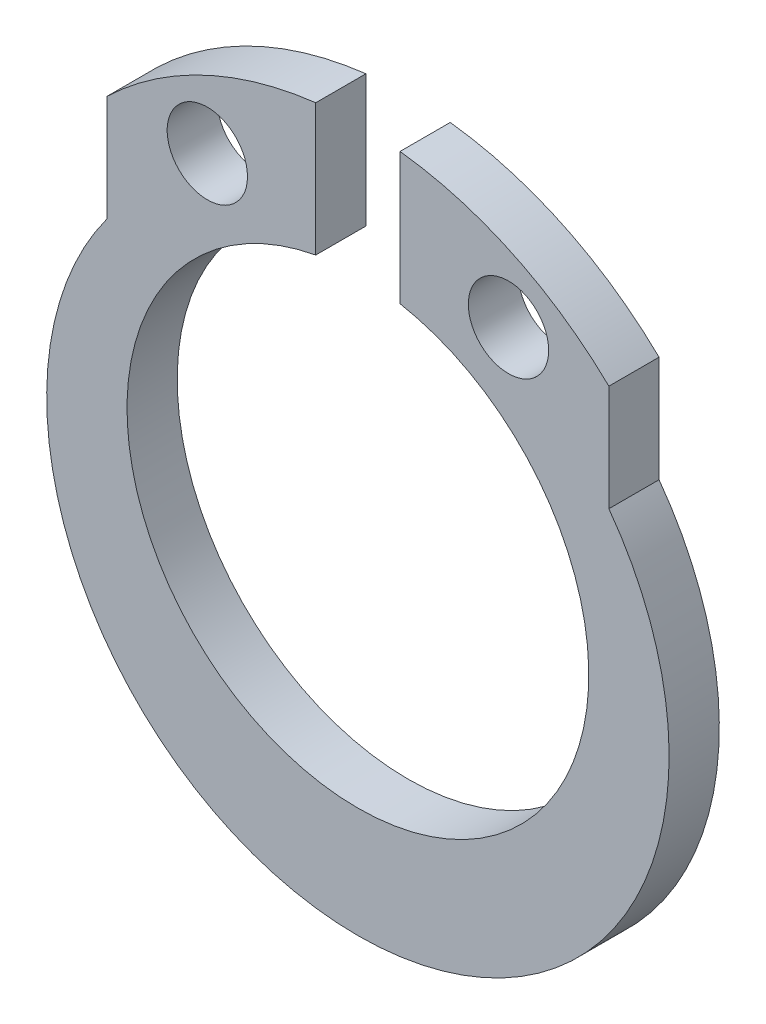
ISO-10303-21;
HEADER;
FILE_DESCRIPTION(('STEP AP214'),'2;1');
FILE_NAME('part.step','',(''),(''),'','','');
FILE_SCHEMA(('AUTOMOTIVE_DESIGN { 1 0 10303 214 1 1 1 1 }'));
ENDSEC;
DATA;
#1=APPLICATION_CONTEXT('core data for automotive mechanical design processes');
#2=APPLICATION_PROTOCOL_DEFINITION('international standard','automotive_design',2000,#1);
#3=PRODUCT_CONTEXT('',#1,'mechanical');
#4=PRODUCT('Part','Part','',(#3));
#5=PRODUCT_RELATED_PRODUCT_CATEGORY('part','',(#4));
#6=PRODUCT_DEFINITION_FORMATION('','',#4);
#7=PRODUCT_DEFINITION_CONTEXT('part definition',#1,'design');
#8=PRODUCT_DEFINITION('design','',#6,#7);
#9=PRODUCT_DEFINITION_SHAPE('','',#8);
#10=(LENGTH_UNIT() NAMED_UNIT(*) SI_UNIT(.MILLI.,.METRE.));
#11=(NAMED_UNIT(*) PLANE_ANGLE_UNIT() SI_UNIT($,.RADIAN.));
#12=(NAMED_UNIT(*) SI_UNIT($,.STERADIAN.) SOLID_ANGLE_UNIT());
#13=UNCERTAINTY_MEASURE_WITH_UNIT(LENGTH_MEASURE(1.E-05),#10,'distance_accuracy_value','');
#14=(GEOMETRIC_REPRESENTATION_CONTEXT(3) GLOBAL_UNCERTAINTY_ASSIGNED_CONTEXT((#13)) GLOBAL_UNIT_ASSIGNED_CONTEXT((#10,
#11,#12)) REPRESENTATION_CONTEXT('',''));
#15=CARTESIAN_POINT('',(0.,0.,0.));
#16=DIRECTION('',(0.,0.,1.));
#17=DIRECTION('',(1.,0.,0.));
#18=AXIS2_PLACEMENT_3D('',#15,#16,#17);
#19=CARTESIAN_POINT('',(0.,0.3,-0.5));
#20=DIRECTION('',(0.,0.,1.));
#21=DIRECTION('',(1.,0.,0.));
#22=AXIS2_PLACEMENT_3D('',#19,#20,#21);
#23=CYLINDRICAL_SURFACE('',#22,3.6);
#24=DIRECTION('',(0.,0.,1.));
#25=VECTOR('',#24,1.);
#26=CARTESIAN_POINT('',(-0.42,3.8754160597055,-0.5));
#27=LINE('',#26,#25);
#28=CARTESIAN_POINT('',(-0.42,3.8754160597055,-0.5));
#29=VERTEX_POINT('',#28);
#30=CARTESIAN_POINT('',(-0.42,3.8754160597055,0.));
#31=VERTEX_POINT('',#30);
#32=EDGE_CURVE('E105',#29,#31,#27,.T.);
#33=ORIENTED_EDGE('',*,*,#32,.F.);
#34=CARTESIAN_POINT('',(0.,0.3,-0.5));
#35=DIRECTION('',(0.,0.,1.));
#36=DIRECTION('',(1.,0.,0.));
#37=AXIS2_PLACEMENT_3D('',#34,#35,#36);
#38=CIRCLE('',#37,3.6);
#39=CARTESIAN_POINT('',(-2.5,2.89036676939772,-0.5));
#40=VERTEX_POINT('',#39);
#41=EDGE_CURVE('E122',#29,#40,#38,.T.);
#42=ORIENTED_EDGE('',*,*,#41,.T.);
#43=DIRECTION('',(0.,0.,1.));
#44=VECTOR('',#43,1.);
#45=CARTESIAN_POINT('',(-2.5,2.89036676939772,-0.5));
#46=LINE('',#45,#44);
#47=CARTESIAN_POINT('',(-2.5,2.89036676939772,0.));
#48=VERTEX_POINT('',#47);
#49=EDGE_CURVE('E124',#40,#48,#46,.T.);
#50=ORIENTED_EDGE('',*,*,#49,.T.);
#51=CARTESIAN_POINT('',(0.,0.3,0.));
#52=DIRECTION('',(0.,0.,1.));
#53=DIRECTION('',(1.,0.,0.));
#54=AXIS2_PLACEMENT_3D('',#51,#52,#53);
#55=CIRCLE('',#54,3.6);
#56=EDGE_CURVE('E139',#31,#48,#55,.T.);
#57=ORIENTED_EDGE('',*,*,#56,.F.);
#58=EDGE_LOOP('',(#33,#42,#50,#57));
#59=FACE_BOUND('',#58,.T.);
#60=ADVANCED_FACE('F35',(#59),#23,.T.);
#61=CARTESIAN_POINT('',(2.5,2.89036676939772,-0.5));
#62=DIRECTION('',(-1.,0.,0.));
#63=DIRECTION('',(0.,-1.,0.));
#64=AXIS2_PLACEMENT_3D('',#61,#62,#63);
#65=PLANE('',#64);
#66=DIRECTION('',(0.,-1.,0.));
#67=VECTOR('',#66,1.);
#68=CARTESIAN_POINT('',(2.5,2.89036676939772,0.));
#69=LINE('',#68,#67);
#70=CARTESIAN_POINT('',(2.5,2.89036676939772,0.));
#71=VERTEX_POINT('',#70);
#72=CARTESIAN_POINT('',(2.5,1.83303027798234,0.));
#73=VERTEX_POINT('',#72);
#74=EDGE_CURVE('E130',#71,#73,#69,.T.);
#75=ORIENTED_EDGE('',*,*,#74,.T.);
#76=DIRECTION('',(0.,0.,1.));
#77=VECTOR('',#76,1.);
#78=CARTESIAN_POINT('',(2.5,1.83303027798234,-0.5));
#79=LINE('',#78,#77);
#80=CARTESIAN_POINT('',(2.5,1.83303027798234,-0.5));
#81=VERTEX_POINT('',#80);
#82=EDGE_CURVE('E11',#81,#73,#79,.T.);
#83=ORIENTED_EDGE('',*,*,#82,.F.);
#84=DIRECTION('',(0.,-1.,0.));
#85=VECTOR('',#84,1.);
#86=CARTESIAN_POINT('',(2.5,2.89036676939772,-0.5));
#87=LINE('',#86,#85);
#88=CARTESIAN_POINT('',(2.5,2.89036676939772,-0.5));
#89=VERTEX_POINT('',#88);
#90=EDGE_CURVE('E141',#89,#81,#87,.T.);
#91=ORIENTED_EDGE('',*,*,#90,.F.);
#92=DIRECTION('',(0.,0.,1.));
#93=VECTOR('',#92,1.);
#94=CARTESIAN_POINT('',(2.5,2.89036676939772,-0.5));
#95=LINE('',#94,#93);
#96=EDGE_CURVE('E120',#89,#71,#95,.T.);
#97=ORIENTED_EDGE('',*,*,#96,.T.);
#98=EDGE_LOOP('',(#75,#83,#91,#97));
#99=FACE_BOUND('',#98,.T.);
#100=ADVANCED_FACE('F37',(#99),#65,.F.);
#101=CARTESIAN_POINT('',(0.,0.,-0.5));
#102=DIRECTION('',(0.,0.,1.));
#103=DIRECTION('',(1.,0.,0.));
#104=AXIS2_PLACEMENT_3D('',#101,#102,#103);
#105=CYLINDRICAL_SURFACE('',#104,3.1);
#106=CARTESIAN_POINT('',(0.,0.,0.));
#107=DIRECTION('',(0.,0.,1.));
#108=DIRECTION('',(1.,0.,0.));
#109=AXIS2_PLACEMENT_3D('',#106,#107,#108);
#110=CIRCLE('',#109,3.1);
#111=CARTESIAN_POINT('',(-2.5,1.83303027798234,0.));
#112=VERTEX_POINT('',#111);
#113=EDGE_CURVE('E133',#112,#73,#110,.T.);
#114=ORIENTED_EDGE('',*,*,#113,.F.);
#115=DIRECTION('',(0.,0.,1.));
#116=VECTOR('',#115,1.);
#117=CARTESIAN_POINT('',(-2.5,1.83303027798234,-0.5));
#118=LINE('',#117,#116);
#119=CARTESIAN_POINT('',(-2.5,1.83303027798234,-0.5));
#120=VERTEX_POINT('',#119);
#121=EDGE_CURVE('E43',#120,#112,#118,.T.);
#122=ORIENTED_EDGE('',*,*,#121,.F.);
#123=CARTESIAN_POINT('',(0.,0.,-0.5));
#124=DIRECTION('',(0.,0.,1.));
#125=DIRECTION('',(1.,0.,0.));
#126=AXIS2_PLACEMENT_3D('',#123,#124,#125);
#127=CIRCLE('',#126,3.1);
#128=EDGE_CURVE('E163',#120,#81,#127,.T.);
#129=ORIENTED_EDGE('',*,*,#128,.T.);
#130=ORIENTED_EDGE('',*,*,#82,.T.);
#131=EDGE_LOOP('',(#114,#122,#129,#130));
#132=FACE_BOUND('',#131,.T.);
#133=ADVANCED_FACE('F154',(#132),#105,.T.);
#134=CARTESIAN_POINT('',(-2.5,2.89036676939772,-0.5));
#135=DIRECTION('',(-1.,0.,0.));
#136=DIRECTION('',(0.,-1.,0.));
#137=AXIS2_PLACEMENT_3D('',#134,#135,#136);
#138=PLANE('',#137);
#139=DIRECTION('',(0.,-1.,0.));
#140=VECTOR('',#139,1.);
#141=CARTESIAN_POINT('',(-2.5,2.89036676939772,0.));
#142=LINE('',#141,#140);
#143=EDGE_CURVE('E136',#48,#112,#142,.T.);
#144=ORIENTED_EDGE('',*,*,#143,.F.);
#145=ORIENTED_EDGE('',*,*,#49,.F.);
#146=DIRECTION('',(0.,-1.,0.));
#147=VECTOR('',#146,1.);
#148=CARTESIAN_POINT('',(-2.5,2.89036676939772,-0.5));
#149=LINE('',#148,#147);
#150=EDGE_CURVE('E126',#40,#120,#149,.T.);
#151=ORIENTED_EDGE('',*,*,#150,.T.);
#152=ORIENTED_EDGE('',*,*,#121,.T.);
#153=EDGE_LOOP('',(#144,#145,#151,#152));
#154=FACE_BOUND('',#153,.T.);
#155=ADVANCED_FACE('F148',(#154),#138,.T.);
#156=DIRECTION('',(0.,0.,1.));
#157=VECTOR('',#156,1.);
#158=CARTESIAN_POINT('',(0.42,3.8754160597055,-0.5));
#159=LINE('',#158,#157);
#160=CARTESIAN_POINT('',(0.42,3.8754160597055,-0.5));
#161=VERTEX_POINT('',#160);
#162=CARTESIAN_POINT('',(0.42,3.8754160597055,0.));
#163=VERTEX_POINT('',#162);
#164=EDGE_CURVE('E97',#161,#163,#159,.T.);
#165=ORIENTED_EDGE('',*,*,#164,.T.);
#166=EDGE_CURVE('E140',#71,#163,#55,.T.);
#167=ORIENTED_EDGE('',*,*,#166,.F.);
#168=ORIENTED_EDGE('',*,*,#96,.F.);
#169=EDGE_CURVE('E113',#89,#161,#38,.T.);
#170=ORIENTED_EDGE('',*,*,#169,.T.);
#171=EDGE_LOOP('',(#165,#167,#168,#170));
#172=FACE_BOUND('',#171,.T.);
#173=ADVANCED_FACE('F119',(#172),#23,.T.);
#174=CARTESIAN_POINT('',(0.,0.,-0.5));
#175=DIRECTION('',(0.,0.,1.));
#176=DIRECTION('',(1.,0.,0.));
#177=AXIS2_PLACEMENT_3D('',#174,#175,#176);
#178=PLANE('',#177);
#179=CARTESIAN_POINT('',(-1.5,2.89807621135332,-0.5));
#180=DIRECTION('',(0.,0.,1.));
#181=DIRECTION('',(1.,0.,0.));
#182=AXIS2_PLACEMENT_3D('',#179,#180,#181);
#183=CIRCLE('',#182,0.4);
#184=CARTESIAN_POINT('',(-1.1,2.89807621135332,-0.5));
#185=VERTEX_POINT('',#184);
#186=EDGE_CURVE('E183',#185,#185,#183,.T.);
#187=ORIENTED_EDGE('',*,*,#186,.T.);
#188=EDGE_LOOP('',(#187));
#189=FACE_BOUND('',#188,.T.);
#190=CARTESIAN_POINT('',(1.5,2.89807621135332,-0.5));
#191=DIRECTION('',(0.,0.,1.));
#192=DIRECTION('',(1.,0.,0.));
#193=AXIS2_PLACEMENT_3D('',#190,#191,#192);
#194=CIRCLE('',#193,0.4);
#195=CARTESIAN_POINT('',(1.9,2.89807621135332,-0.5));
#196=VERTEX_POINT('',#195);
#197=EDGE_CURVE('E176',#196,#196,#194,.T.);
#198=ORIENTED_EDGE('',*,*,#197,.T.);
#199=EDGE_LOOP('',(#198));
#200=FACE_BOUND('',#199,.T.);
#201=ORIENTED_EDGE('',*,*,#41,.F.);
#202=DIRECTION('',(0.,-1.,0.));
#203=VECTOR('',#202,1.);
#204=CARTESIAN_POINT('',(-0.42,3.8754160597055,-0.5));
#205=LINE('',#204,#203);
#206=CARTESIAN_POINT('',(-0.42,2.56132704401641,-0.5));
#207=VERTEX_POINT('',#206);
#208=EDGE_CURVE('E117',#29,#207,#205,.T.);
#209=ORIENTED_EDGE('',*,*,#208,.T.);
#210=CARTESIAN_POINT('',(0.,0.3,-0.5));
#211=DIRECTION('',(0.,0.,1.));
#212=DIRECTION('',(1.,0.,0.));
#213=AXIS2_PLACEMENT_3D('',#210,#211,#212);
#214=CIRCLE('',#213,2.3);
#215=CARTESIAN_POINT('',(0.42,2.56132704401641,-0.5));
#216=VERTEX_POINT('',#215);
#217=EDGE_CURVE('E116',#207,#216,#214,.T.);
#218=ORIENTED_EDGE('',*,*,#217,.T.);
#219=DIRECTION('',(0.,1.,0.));
#220=VECTOR('',#219,1.);
#221=CARTESIAN_POINT('',(0.42,3.8754160597055,-0.5));
#222=LINE('',#221,#220);
#223=EDGE_CURVE('E58',#216,#161,#222,.T.);
#224=ORIENTED_EDGE('',*,*,#223,.T.);
#225=ORIENTED_EDGE('',*,*,#169,.F.);
#226=ORIENTED_EDGE('',*,*,#90,.T.);
#227=ORIENTED_EDGE('',*,*,#128,.F.);
#228=ORIENTED_EDGE('',*,*,#150,.F.);
#229=EDGE_LOOP('',(#201,#209,#218,#224,#225,#226,#227,#228));
#230=FACE_BOUND('',#229,.T.);
#231=ADVANCED_FACE('F112',(#189,#200,#230),#178,.F.);
#232=CARTESIAN_POINT('',(0.,0.,0.));
#233=DIRECTION('',(0.,0.,1.));
#234=DIRECTION('',(1.,0.,0.));
#235=AXIS2_PLACEMENT_3D('',#232,#233,#234);
#236=PLANE('',#235);
#237=CARTESIAN_POINT('',(-1.5,2.89807621135332,0.));
#238=DIRECTION('',(0.,0.,1.));
#239=DIRECTION('',(1.,0.,0.));
#240=AXIS2_PLACEMENT_3D('',#237,#238,#239);
#241=CIRCLE('',#240,0.4);
#242=CARTESIAN_POINT('',(-1.1,2.89807621135332,0.));
#243=VERTEX_POINT('',#242);
#244=EDGE_CURVE('E186',#243,#243,#241,.T.);
#245=ORIENTED_EDGE('',*,*,#244,.F.);
#246=EDGE_LOOP('',(#245));
#247=FACE_BOUND('',#246,.T.);
#248=CARTESIAN_POINT('',(1.5,2.89807621135332,0.));
#249=DIRECTION('',(0.,0.,1.));
#250=DIRECTION('',(1.,0.,0.));
#251=AXIS2_PLACEMENT_3D('',#248,#249,#250);
#252=CIRCLE('',#251,0.4);
#253=CARTESIAN_POINT('',(1.9,2.89807621135332,0.));
#254=VERTEX_POINT('',#253);
#255=EDGE_CURVE('E180',#254,#254,#252,.T.);
#256=ORIENTED_EDGE('',*,*,#255,.F.);
#257=EDGE_LOOP('',(#256));
#258=FACE_BOUND('',#257,.T.);
#259=DIRECTION('',(0.,-1.,0.));
#260=VECTOR('',#259,1.);
#261=CARTESIAN_POINT('',(-0.42,3.8754160597055,0.));
#262=LINE('',#261,#260);
#263=CARTESIAN_POINT('',(-0.42,2.56132704401641,0.));
#264=VERTEX_POINT('',#263);
#265=EDGE_CURVE('E50',#31,#264,#262,.T.);
#266=ORIENTED_EDGE('',*,*,#265,.F.);
#267=ORIENTED_EDGE('',*,*,#56,.T.);
#268=ORIENTED_EDGE('',*,*,#143,.T.);
#269=ORIENTED_EDGE('',*,*,#113,.T.);
#270=ORIENTED_EDGE('',*,*,#74,.F.);
#271=ORIENTED_EDGE('',*,*,#166,.T.);
#272=DIRECTION('',(0.,1.,0.));
#273=VECTOR('',#272,1.);
#274=CARTESIAN_POINT('',(0.42,3.8754160597055,0.));
#275=LINE('',#274,#273);
#276=CARTESIAN_POINT('',(0.42,2.56132704401641,0.));
#277=VERTEX_POINT('',#276);
#278=EDGE_CURVE('E100',#277,#163,#275,.T.);
#279=ORIENTED_EDGE('',*,*,#278,.F.);
#280=CARTESIAN_POINT('',(0.,0.3,0.));
#281=DIRECTION('',(0.,0.,1.));
#282=DIRECTION('',(1.,0.,0.));
#283=AXIS2_PLACEMENT_3D('',#280,#281,#282);
#284=CIRCLE('',#283,2.3);
#285=EDGE_CURVE('E166',#264,#277,#284,.T.);
#286=ORIENTED_EDGE('',*,*,#285,.F.);
#287=EDGE_LOOP('',(#266,#267,#268,#269,#270,#271,#279,#286));
#288=FACE_BOUND('',#287,.T.);
#289=ADVANCED_FACE('F158',(#247,#258,#288),#236,.T.);
#290=CARTESIAN_POINT('',(0.,0.3,-0.5));
#291=DIRECTION('',(0.,0.,1.));
#292=DIRECTION('',(1.,0.,0.));
#293=AXIS2_PLACEMENT_3D('',#290,#291,#292);
#294=CYLINDRICAL_SURFACE('',#293,2.3);
#295=ORIENTED_EDGE('',*,*,#217,.F.);
#296=DIRECTION('',(0.,0.,1.));
#297=VECTOR('',#296,1.);
#298=CARTESIAN_POINT('',(-0.42,2.56132704401641,-0.5));
#299=LINE('',#298,#297);
#300=EDGE_CURVE('E169',#207,#264,#299,.T.);
#301=ORIENTED_EDGE('',*,*,#300,.T.);
#302=ORIENTED_EDGE('',*,*,#285,.T.);
#303=DIRECTION('',(0.,0.,1.));
#304=VECTOR('',#303,1.);
#305=CARTESIAN_POINT('',(0.42,2.56132704401641,-0.5));
#306=LINE('',#305,#304);
#307=EDGE_CURVE('E106',#216,#277,#306,.T.);
#308=ORIENTED_EDGE('',*,*,#307,.F.);
#309=EDGE_LOOP('',(#295,#301,#302,#308));
#310=FACE_BOUND('',#309,.T.);
#311=ADVANCED_FACE('F194',(#310),#294,.F.);
#312=CARTESIAN_POINT('',(0.42,3.8754160597055,-0.5));
#313=DIRECTION('',(1.,0.,0.));
#314=DIRECTION('',(0.,1.,0.));
#315=AXIS2_PLACEMENT_3D('',#312,#313,#314);
#316=PLANE('',#315);
#317=ORIENTED_EDGE('',*,*,#278,.T.);
#318=ORIENTED_EDGE('',*,*,#164,.F.);
#319=ORIENTED_EDGE('',*,*,#223,.F.);
#320=ORIENTED_EDGE('',*,*,#307,.T.);
#321=EDGE_LOOP('',(#317,#318,#319,#320));
#322=FACE_BOUND('',#321,.T.);
#323=ADVANCED_FACE('F98',(#322),#316,.F.);
#324=CARTESIAN_POINT('',(-0.42,3.8754160597055,-0.5));
#325=DIRECTION('',(-1.,0.,0.));
#326=DIRECTION('',(0.,-1.,0.));
#327=AXIS2_PLACEMENT_3D('',#324,#325,#326);
#328=PLANE('',#327);
#329=ORIENTED_EDGE('',*,*,#265,.T.);
#330=ORIENTED_EDGE('',*,*,#300,.F.);
#331=ORIENTED_EDGE('',*,*,#208,.F.);
#332=ORIENTED_EDGE('',*,*,#32,.T.);
#333=EDGE_LOOP('',(#329,#330,#331,#332));
#334=FACE_BOUND('',#333,.T.);
#335=ADVANCED_FACE('F200',(#334),#328,.F.);
#336=CARTESIAN_POINT('',(1.5,2.89807621135332,0.));
#337=DIRECTION('',(0.,0.,1.));
#338=DIRECTION('',(1.,0.,0.));
#339=AXIS2_PLACEMENT_3D('',#336,#337,#338);
#340=CYLINDRICAL_SURFACE('',#339,0.4);
#341=ORIENTED_EDGE('',*,*,#197,.F.);
#342=EDGE_LOOP('',(#341));
#343=FACE_BOUND('',#342,.T.);
#344=ORIENTED_EDGE('',*,*,#255,.T.);
#345=EDGE_LOOP('',(#344));
#346=FACE_BOUND('',#345,.T.);
#347=ADVANCED_FACE('F198',(#343,#346),#340,.F.);
#348=CARTESIAN_POINT('',(-1.5,2.89807621135332,0.));
#349=DIRECTION('',(0.,0.,1.));
#350=DIRECTION('',(1.,0.,0.));
#351=AXIS2_PLACEMENT_3D('',#348,#349,#350);
#352=CYLINDRICAL_SURFACE('',#351,0.4);
#353=ORIENTED_EDGE('',*,*,#186,.F.);
#354=EDGE_LOOP('',(#353));
#355=FACE_BOUND('',#354,.T.);
#356=ORIENTED_EDGE('',*,*,#244,.T.);
#357=EDGE_LOOP('',(#356));
#358=FACE_BOUND('',#357,.T.);
#359=ADVANCED_FACE('F190',(#355,#358),#352,.F.);
#360=CLOSED_SHELL('',(#60,#100,#133,#155,#173,#231,#289,#311,#323,#335,#347,#359));
#361=MANIFOLD_SOLID_BREP('B2',#360);
#362=ADVANCED_BREP_SHAPE_REPRESENTATION('',(#18,#361),#14);
#363=SHAPE_DEFINITION_REPRESENTATION(#9,#362);
ENDSEC;
END-ISO-10303-21;
